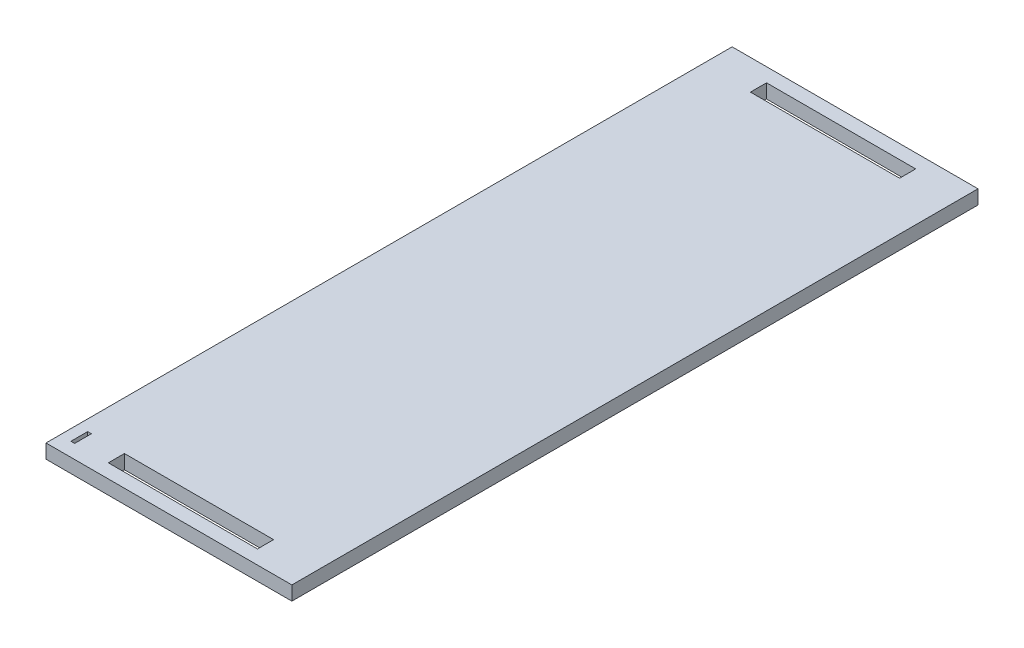
ISO-10303-21;
HEADER;
FILE_DESCRIPTION(('STEP AP214'),'2;1');
FILE_NAME('part.step','',(''),(''),'','','');
FILE_SCHEMA(('AUTOMOTIVE_DESIGN { 1 0 10303 214 1 1 1 1 }'));
ENDSEC;
DATA;
#1=APPLICATION_CONTEXT('core data for automotive mechanical design processes');
#2=APPLICATION_PROTOCOL_DEFINITION('international standard','automotive_design',2000,#1);
#3=PRODUCT_CONTEXT('',#1,'mechanical');
#4=PRODUCT('Part','Part','',(#3));
#5=PRODUCT_RELATED_PRODUCT_CATEGORY('part','',(#4));
#6=PRODUCT_DEFINITION_FORMATION('','',#4);
#7=PRODUCT_DEFINITION_CONTEXT('part definition',#1,'design');
#8=PRODUCT_DEFINITION('design','',#6,#7);
#9=PRODUCT_DEFINITION_SHAPE('','',#8);
#10=(LENGTH_UNIT() NAMED_UNIT(*) SI_UNIT(.MILLI.,.METRE.));
#11=(NAMED_UNIT(*) PLANE_ANGLE_UNIT() SI_UNIT($,.RADIAN.));
#12=(NAMED_UNIT(*) SI_UNIT($,.STERADIAN.) SOLID_ANGLE_UNIT());
#13=UNCERTAINTY_MEASURE_WITH_UNIT(LENGTH_MEASURE(1.E-05),#10,'distance_accuracy_value','');
#14=(GEOMETRIC_REPRESENTATION_CONTEXT(3) GLOBAL_UNCERTAINTY_ASSIGNED_CONTEXT((#13)) GLOBAL_UNIT_ASSIGNED_CONTEXT((#10,
#11,#12)) REPRESENTATION_CONTEXT('',''));
#15=CARTESIAN_POINT('',(0.,0.,0.));
#16=DIRECTION('',(0.,0.,1.));
#17=DIRECTION('',(1.,0.,0.));
#18=AXIS2_PLACEMENT_3D('',#15,#16,#17);
#19=CARTESIAN_POINT('',(0.,2.9972,0.));
#20=DIRECTION('',(0.,1.,0.));
#21=DIRECTION('',(0.,0.,1.));
#22=AXIS2_PLACEMENT_3D('',#19,#20,#21);
#23=PLANE('',#22);
#24=DIRECTION('',(0.,0.,1.));
#25=VECTOR('',#24,1.);
#26=CARTESIAN_POINT('',(-26.1690230999999,2.9972,73.025));
#27=LINE('',#26,#25);
#28=CARTESIAN_POINT('',(-26.1690230999999,2.9972,-73.025));
#29=VERTEX_POINT('',#28);
#30=CARTESIAN_POINT('',(-26.1690230999999,2.9972,73.025));
#31=VERTEX_POINT('',#30);
#32=EDGE_CURVE('E287',#29,#31,#27,.T.);
#33=ORIENTED_EDGE('',*,*,#32,.T.);
#34=DIRECTION('',(1.,0.,0.));
#35=VECTOR('',#34,1.);
#36=CARTESIAN_POINT('',(26.1690231000001,2.9972,73.025));
#37=LINE('',#36,#35);
#38=CARTESIAN_POINT('',(26.1690231000001,2.9972,73.025));
#39=VERTEX_POINT('',#38);
#40=EDGE_CURVE('E291',#31,#39,#37,.T.);
#41=ORIENTED_EDGE('',*,*,#40,.T.);
#42=DIRECTION('',(0.,0.,-1.));
#43=VECTOR('',#42,1.);
#44=CARTESIAN_POINT('',(26.1690231000001,2.9972,73.025));
#45=LINE('',#44,#43);
#46=CARTESIAN_POINT('',(26.1690231000001,2.9972,-73.025));
#47=VERTEX_POINT('',#46);
#48=EDGE_CURVE('E295',#39,#47,#45,.T.);
#49=ORIENTED_EDGE('',*,*,#48,.T.);
#50=DIRECTION('',(-1.,0.,0.));
#51=VECTOR('',#50,1.);
#52=CARTESIAN_POINT('',(26.1690231000001,2.9972,-73.025));
#53=LINE('',#52,#51);
#54=EDGE_CURVE('E298',#47,#29,#53,.T.);
#55=ORIENTED_EDGE('',*,*,#54,.T.);
#56=EDGE_LOOP('',(#33,#41,#49,#55));
#57=FACE_BOUND('',#56,.T.);
#58=DIRECTION('',(1.,0.,0.));
#59=VECTOR('',#58,1.);
#60=CARTESIAN_POINT('',(-15.875,2.9972,-66.6242));
#61=LINE('',#60,#59);
#62=CARTESIAN_POINT('',(-15.875,2.9972,-66.6242));
#63=VERTEX_POINT('',#62);
#64=CARTESIAN_POINT('',(15.875,2.9972,-66.6242));
#65=VERTEX_POINT('',#64);
#66=EDGE_CURVE('E247',#63,#65,#61,.T.);
#67=ORIENTED_EDGE('',*,*,#66,.F.);
#68=DIRECTION('',(0.,0.,1.));
#69=VECTOR('',#68,1.);
#70=CARTESIAN_POINT('',(-15.875,2.9972,-70.0532));
#71=LINE('',#70,#69);
#72=CARTESIAN_POINT('',(-15.875,2.9972,-70.0532));
#73=VERTEX_POINT('',#72);
#74=EDGE_CURVE('E244',#73,#63,#71,.T.);
#75=ORIENTED_EDGE('',*,*,#74,.F.);
#76=DIRECTION('',(-1.,0.,0.));
#77=VECTOR('',#76,1.);
#78=CARTESIAN_POINT('',(-15.875,2.9972,-70.0532));
#79=LINE('',#78,#77);
#80=CARTESIAN_POINT('',(15.875,2.9972,-70.0532));
#81=VERTEX_POINT('',#80);
#82=EDGE_CURVE('E255',#81,#73,#79,.T.);
#83=ORIENTED_EDGE('',*,*,#82,.F.);
#84=DIRECTION('',(0.,0.,-1.));
#85=VECTOR('',#84,1.);
#86=CARTESIAN_POINT('',(15.875,2.9972,-70.0532));
#87=LINE('',#86,#85);
#88=EDGE_CURVE('E251',#65,#81,#87,.T.);
#89=ORIENTED_EDGE('',*,*,#88,.F.);
#90=EDGE_LOOP('',(#67,#75,#83,#89));
#91=FACE_BOUND('',#90,.T.);
#92=DIRECTION('',(1.,0.,0.));
#93=VECTOR('',#92,1.);
#94=CARTESIAN_POINT('',(-15.875,2.9972,70.0532));
#95=LINE('',#94,#93);
#96=CARTESIAN_POINT('',(-15.875,2.9972,70.0532));
#97=VERTEX_POINT('',#96);
#98=CARTESIAN_POINT('',(15.875,2.9972,70.0532));
#99=VERTEX_POINT('',#98);
#100=EDGE_CURVE('E204',#97,#99,#95,.T.);
#101=ORIENTED_EDGE('',*,*,#100,.F.);
#102=DIRECTION('',(0.,0.,1.));
#103=VECTOR('',#102,1.);
#104=CARTESIAN_POINT('',(-15.875,2.9972,66.6242));
#105=LINE('',#104,#103);
#106=CARTESIAN_POINT('',(-15.875,2.9972,66.6242));
#107=VERTEX_POINT('',#106);
#108=EDGE_CURVE('E201',#107,#97,#105,.T.);
#109=ORIENTED_EDGE('',*,*,#108,.F.);
#110=DIRECTION('',(-1.,0.,0.));
#111=VECTOR('',#110,1.);
#112=CARTESIAN_POINT('',(-15.875,2.9972,66.6242));
#113=LINE('',#112,#111);
#114=CARTESIAN_POINT('',(15.875,2.9972,66.6242));
#115=VERTEX_POINT('',#114);
#116=EDGE_CURVE('E212',#115,#107,#113,.T.);
#117=ORIENTED_EDGE('',*,*,#116,.F.);
#118=DIRECTION('',(0.,0.,-1.));
#119=VECTOR('',#118,1.);
#120=CARTESIAN_POINT('',(15.875,2.9972,66.6242));
#121=LINE('',#120,#119);
#122=EDGE_CURVE('E208',#99,#115,#121,.T.);
#123=ORIENTED_EDGE('',*,*,#122,.F.);
#124=EDGE_LOOP('',(#101,#109,#117,#123));
#125=FACE_BOUND('',#124,.T.);
#126=DIRECTION('',(1.,0.,0.));
#127=VECTOR('',#126,1.);
#128=CARTESIAN_POINT('',(-23.8297399915825,2.9972,70.0532));
#129=LINE('',#128,#127);
#130=CARTESIAN_POINT('',(-23.8297399915825,2.9972,70.0532));
#131=VERTEX_POINT('',#130);
#132=CARTESIAN_POINT('',(-23.0359899915825,2.9972,70.0532));
#133=VERTEX_POINT('',#132);
#134=EDGE_CURVE('E162',#131,#133,#129,.T.);
#135=ORIENTED_EDGE('',*,*,#134,.F.);
#136=DIRECTION('',(0.,0.,1.));
#137=VECTOR('',#136,1.);
#138=CARTESIAN_POINT('',(-23.8297399915825,2.9972,66.4972));
#139=LINE('',#138,#137);
#140=CARTESIAN_POINT('',(-23.8297399915825,2.9972,66.4972));
#141=VERTEX_POINT('',#140);
#142=EDGE_CURVE('E153',#141,#131,#139,.T.);
#143=ORIENTED_EDGE('',*,*,#142,.F.);
#144=DIRECTION('',(-1.,0.,0.));
#145=VECTOR('',#144,1.);
#146=CARTESIAN_POINT('',(-23.8297399915825,2.9972,66.4972));
#147=LINE('',#146,#145);
#148=CARTESIAN_POINT('',(-23.0359899915825,2.9972,66.4972));
#149=VERTEX_POINT('',#148);
#150=EDGE_CURVE('E179',#149,#141,#147,.T.);
#151=ORIENTED_EDGE('',*,*,#150,.F.);
#152=DIRECTION('',(0.,0.,-1.));
#153=VECTOR('',#152,1.);
#154=CARTESIAN_POINT('',(-23.0359899915825,2.9972,66.4972));
#155=LINE('',#154,#153);
#156=EDGE_CURVE('E175',#133,#149,#155,.T.);
#157=ORIENTED_EDGE('',*,*,#156,.F.);
#158=EDGE_LOOP('',(#135,#143,#151,#157));
#159=FACE_BOUND('',#158,.T.);
#160=ADVANCED_FACE('F39',(#57,#91,#125,#159),#23,.T.);
#161=CARTESIAN_POINT('',(0.,0.,0.));
#162=DIRECTION('',(0.,1.,0.));
#163=DIRECTION('',(0.,0.,1.));
#164=AXIS2_PLACEMENT_3D('',#161,#162,#163);
#165=PLANE('',#164);
#166=DIRECTION('',(0.,0.,1.));
#167=VECTOR('',#166,1.);
#168=CARTESIAN_POINT('',(-15.875,0.,66.6242));
#169=LINE('',#168,#167);
#170=CARTESIAN_POINT('',(-15.875,0.,66.6242));
#171=VERTEX_POINT('',#170);
#172=CARTESIAN_POINT('',(-15.875,0.,70.0532));
#173=VERTEX_POINT('',#172);
#174=EDGE_CURVE('E171',#171,#173,#169,.T.);
#175=ORIENTED_EDGE('',*,*,#174,.T.);
#176=DIRECTION('',(1.,0.,0.));
#177=VECTOR('',#176,1.);
#178=CARTESIAN_POINT('',(-15.875,0.,70.0532));
#179=LINE('',#178,#177);
#180=CARTESIAN_POINT('',(15.875,0.,70.0532));
#181=VERTEX_POINT('',#180);
#182=EDGE_CURVE('E219',#173,#181,#179,.T.);
#183=ORIENTED_EDGE('',*,*,#182,.T.);
#184=DIRECTION('',(0.,0.,-1.));
#185=VECTOR('',#184,1.);
#186=CARTESIAN_POINT('',(15.875,0.,66.6242));
#187=LINE('',#186,#185);
#188=CARTESIAN_POINT('',(15.875,0.,66.6242));
#189=VERTEX_POINT('',#188);
#190=EDGE_CURVE('E223',#181,#189,#187,.T.);
#191=ORIENTED_EDGE('',*,*,#190,.T.);
#192=DIRECTION('',(-1.,0.,0.));
#193=VECTOR('',#192,1.);
#194=CARTESIAN_POINT('',(-15.875,0.,66.6242));
#195=LINE('',#194,#193);
#196=EDGE_CURVE('E205',#189,#171,#195,.T.);
#197=ORIENTED_EDGE('',*,*,#196,.T.);
#198=EDGE_LOOP('',(#175,#183,#191,#197));
#199=FACE_BOUND('',#198,.T.);
#200=DIRECTION('',(0.,0.,1.));
#201=VECTOR('',#200,1.);
#202=CARTESIAN_POINT('',(-26.1690230999999,0.,73.025));
#203=LINE('',#202,#201);
#204=CARTESIAN_POINT('',(-26.1690230999999,0.,-73.025));
#205=VERTEX_POINT('',#204);
#206=CARTESIAN_POINT('',(-26.1690230999999,0.,73.025));
#207=VERTEX_POINT('',#206);
#208=EDGE_CURVE('E286',#205,#207,#203,.T.);
#209=ORIENTED_EDGE('',*,*,#208,.F.);
#210=DIRECTION('',(-1.,0.,0.));
#211=VECTOR('',#210,1.);
#212=CARTESIAN_POINT('',(26.1690231000001,0.,-73.025));
#213=LINE('',#212,#211);
#214=CARTESIAN_POINT('',(26.1690231000001,0.,-73.025));
#215=VERTEX_POINT('',#214);
#216=EDGE_CURVE('E292',#215,#205,#213,.T.);
#217=ORIENTED_EDGE('',*,*,#216,.F.);
#218=DIRECTION('',(0.,0.,-1.));
#219=VECTOR('',#218,1.);
#220=CARTESIAN_POINT('',(26.1690231000001,0.,73.025));
#221=LINE('',#220,#219);
#222=CARTESIAN_POINT('',(26.1690231000001,0.,73.025));
#223=VERTEX_POINT('',#222);
#224=EDGE_CURVE('E308',#223,#215,#221,.T.);
#225=ORIENTED_EDGE('',*,*,#224,.F.);
#226=DIRECTION('',(1.,0.,0.));
#227=VECTOR('',#226,1.);
#228=CARTESIAN_POINT('',(26.1690231000001,0.,73.025));
#229=LINE('',#228,#227);
#230=EDGE_CURVE('E305',#207,#223,#229,.T.);
#231=ORIENTED_EDGE('',*,*,#230,.F.);
#232=EDGE_LOOP('',(#209,#217,#225,#231));
#233=FACE_BOUND('',#232,.T.);
#234=DIRECTION('',(0.,0.,1.));
#235=VECTOR('',#234,1.);
#236=CARTESIAN_POINT('',(-15.875,0.,-70.0532));
#237=LINE('',#236,#235);
#238=CARTESIAN_POINT('',(-15.875,0.,-70.0532));
#239=VERTEX_POINT('',#238);
#240=CARTESIAN_POINT('',(-15.875,0.,-66.6242));
#241=VERTEX_POINT('',#240);
#242=EDGE_CURVE('E243',#239,#241,#237,.T.);
#243=ORIENTED_EDGE('',*,*,#242,.T.);
#244=DIRECTION('',(1.,0.,0.));
#245=VECTOR('',#244,1.);
#246=CARTESIAN_POINT('',(-15.875,0.,-66.6242));
#247=LINE('',#246,#245);
#248=CARTESIAN_POINT('',(15.875,0.,-66.6242));
#249=VERTEX_POINT('',#248);
#250=EDGE_CURVE('E262',#241,#249,#247,.T.);
#251=ORIENTED_EDGE('',*,*,#250,.T.);
#252=DIRECTION('',(0.,0.,-1.));
#253=VECTOR('',#252,1.);
#254=CARTESIAN_POINT('',(15.875,0.,-70.0532));
#255=LINE('',#254,#253);
#256=CARTESIAN_POINT('',(15.875,0.,-70.0532));
#257=VERTEX_POINT('',#256);
#258=EDGE_CURVE('E266',#249,#257,#255,.T.);
#259=ORIENTED_EDGE('',*,*,#258,.T.);
#260=DIRECTION('',(-1.,0.,0.));
#261=VECTOR('',#260,1.);
#262=CARTESIAN_POINT('',(-15.875,0.,-70.0532));
#263=LINE('',#262,#261);
#264=EDGE_CURVE('E248',#257,#239,#263,.T.);
#265=ORIENTED_EDGE('',*,*,#264,.T.);
#266=EDGE_LOOP('',(#243,#251,#259,#265));
#267=FACE_BOUND('',#266,.T.);
#268=DIRECTION('',(0.,0.,1.));
#269=VECTOR('',#268,1.);
#270=CARTESIAN_POINT('',(-23.8297399915825,0.,66.4972));
#271=LINE('',#270,#269);
#272=CARTESIAN_POINT('',(-23.8297399915825,0.,66.4972));
#273=VERTEX_POINT('',#272);
#274=CARTESIAN_POINT('',(-23.8297399915825,0.,70.0532));
#275=VERTEX_POINT('',#274);
#276=EDGE_CURVE('E63',#273,#275,#271,.T.);
#277=ORIENTED_EDGE('',*,*,#276,.T.);
#278=DIRECTION('',(1.,0.,0.));
#279=VECTOR('',#278,1.);
#280=CARTESIAN_POINT('',(-23.8297399915825,0.,70.0532));
#281=LINE('',#280,#279);
#282=CARTESIAN_POINT('',(-23.0359899915825,0.,70.0532));
#283=VERTEX_POINT('',#282);
#284=EDGE_CURVE('E169',#275,#283,#281,.T.);
#285=ORIENTED_EDGE('',*,*,#284,.T.);
#286=DIRECTION('',(0.,0.,-1.));
#287=VECTOR('',#286,1.);
#288=CARTESIAN_POINT('',(-23.0359899915825,0.,66.4972));
#289=LINE('',#288,#287);
#290=CARTESIAN_POINT('',(-23.0359899915825,0.,66.4972));
#291=VERTEX_POINT('',#290);
#292=EDGE_CURVE('E188',#283,#291,#289,.T.);
#293=ORIENTED_EDGE('',*,*,#292,.T.);
#294=DIRECTION('',(-1.,0.,0.));
#295=VECTOR('',#294,1.);
#296=CARTESIAN_POINT('',(-23.8297399915825,0.,66.4972));
#297=LINE('',#296,#295);
#298=EDGE_CURVE('E163',#291,#273,#297,.T.);
#299=ORIENTED_EDGE('',*,*,#298,.T.);
#300=EDGE_LOOP('',(#277,#285,#293,#299));
#301=FACE_BOUND('',#300,.T.);
#302=ADVANCED_FACE('F331',(#199,#233,#267,#301),#165,.F.);
#303=CARTESIAN_POINT('',(-26.1690230999999,2.9972,73.025));
#304=DIRECTION('',(1.,0.,0.));
#305=DIRECTION('',(0.,0.,-1.));
#306=AXIS2_PLACEMENT_3D('',#303,#304,#305);
#307=PLANE('',#306);
#308=ORIENTED_EDGE('',*,*,#208,.T.);
#309=DIRECTION('',(0.,-1.,0.));
#310=VECTOR('',#309,1.);
#311=CARTESIAN_POINT('',(-26.1690230999999,2.9972,73.025));
#312=LINE('',#311,#310);
#313=EDGE_CURVE('E11',#31,#207,#312,.T.);
#314=ORIENTED_EDGE('',*,*,#313,.F.);
#315=ORIENTED_EDGE('',*,*,#32,.F.);
#316=DIRECTION('',(0.,-1.,0.));
#317=VECTOR('',#316,1.);
#318=CARTESIAN_POINT('',(-26.1690230999999,2.9972,-73.025));
#319=LINE('',#318,#317);
#320=EDGE_CURVE('E301',#29,#205,#319,.T.);
#321=ORIENTED_EDGE('',*,*,#320,.T.);
#322=EDGE_LOOP('',(#308,#314,#315,#321));
#323=FACE_BOUND('',#322,.T.);
#324=ADVANCED_FACE('F41',(#323),#307,.F.);
#325=CARTESIAN_POINT('',(26.1690231000001,2.9972,73.025));
#326=DIRECTION('',(0.,0.,-1.));
#327=DIRECTION('',(-1.,0.,0.));
#328=AXIS2_PLACEMENT_3D('',#325,#326,#327);
#329=PLANE('',#328);
#330=ORIENTED_EDGE('',*,*,#230,.T.);
#331=DIRECTION('',(0.,-1.,0.));
#332=VECTOR('',#331,1.);
#333=CARTESIAN_POINT('',(26.1690231000001,2.9972,73.025));
#334=LINE('',#333,#332);
#335=EDGE_CURVE('E48',#39,#223,#334,.T.);
#336=ORIENTED_EDGE('',*,*,#335,.F.);
#337=ORIENTED_EDGE('',*,*,#40,.F.);
#338=ORIENTED_EDGE('',*,*,#313,.T.);
#339=EDGE_LOOP('',(#330,#336,#337,#338));
#340=FACE_BOUND('',#339,.T.);
#341=ADVANCED_FACE('F342',(#340),#329,.F.);
#342=CARTESIAN_POINT('',(26.1690231000001,2.9972,73.025));
#343=DIRECTION('',(-1.,0.,0.));
#344=DIRECTION('',(0.,0.,1.));
#345=AXIS2_PLACEMENT_3D('',#342,#343,#344);
#346=PLANE('',#345);
#347=ORIENTED_EDGE('',*,*,#224,.T.);
#348=DIRECTION('',(0.,-1.,0.));
#349=VECTOR('',#348,1.);
#350=CARTESIAN_POINT('',(26.1690231000001,2.9972,-73.025));
#351=LINE('',#350,#349);
#352=EDGE_CURVE('E316',#47,#215,#351,.T.);
#353=ORIENTED_EDGE('',*,*,#352,.F.);
#354=ORIENTED_EDGE('',*,*,#48,.F.);
#355=ORIENTED_EDGE('',*,*,#335,.T.);
#356=EDGE_LOOP('',(#347,#353,#354,#355));
#357=FACE_BOUND('',#356,.T.);
#358=ADVANCED_FACE('F325',(#357),#346,.F.);
#359=CARTESIAN_POINT('',(26.1690231000001,2.9972,-73.025));
#360=DIRECTION('',(0.,0.,1.));
#361=DIRECTION('',(1.,0.,0.));
#362=AXIS2_PLACEMENT_3D('',#359,#360,#361);
#363=PLANE('',#362);
#364=ORIENTED_EDGE('',*,*,#216,.T.);
#365=ORIENTED_EDGE('',*,*,#320,.F.);
#366=ORIENTED_EDGE('',*,*,#54,.F.);
#367=ORIENTED_EDGE('',*,*,#352,.T.);
#368=EDGE_LOOP('',(#364,#365,#366,#367));
#369=FACE_BOUND('',#368,.T.);
#370=ADVANCED_FACE('F335',(#369),#363,.F.);
#371=CARTESIAN_POINT('',(-15.875,2.9972,-70.0532));
#372=DIRECTION('',(1.,0.,0.));
#373=DIRECTION('',(0.,0.,-1.));
#374=AXIS2_PLACEMENT_3D('',#371,#372,#373);
#375=PLANE('',#374);
#376=ORIENTED_EDGE('',*,*,#242,.F.);
#377=DIRECTION('',(0.,-1.,0.));
#378=VECTOR('',#377,1.);
#379=CARTESIAN_POINT('',(-15.875,2.9972,-70.0532));
#380=LINE('',#379,#378);
#381=EDGE_CURVE('E258',#73,#239,#380,.T.);
#382=ORIENTED_EDGE('',*,*,#381,.F.);
#383=ORIENTED_EDGE('',*,*,#74,.T.);
#384=DIRECTION('',(0.,-1.,0.));
#385=VECTOR('',#384,1.);
#386=CARTESIAN_POINT('',(-15.875,2.9972,-66.6242));
#387=LINE('',#386,#385);
#388=EDGE_CURVE('E282',#63,#241,#387,.T.);
#389=ORIENTED_EDGE('',*,*,#388,.T.);
#390=EDGE_LOOP('',(#376,#382,#383,#389));
#391=FACE_BOUND('',#390,.T.);
#392=ADVANCED_FACE('F357',(#391),#375,.T.);
#393=CARTESIAN_POINT('',(-15.875,2.9972,-66.6242));
#394=DIRECTION('',(0.,0.,-1.));
#395=DIRECTION('',(-1.,0.,0.));
#396=AXIS2_PLACEMENT_3D('',#393,#394,#395);
#397=PLANE('',#396);
#398=ORIENTED_EDGE('',*,*,#250,.F.);
#399=ORIENTED_EDGE('',*,*,#388,.F.);
#400=ORIENTED_EDGE('',*,*,#66,.T.);
#401=DIRECTION('',(0.,-1.,0.));
#402=VECTOR('',#401,1.);
#403=CARTESIAN_POINT('',(15.875,2.9972,-66.6242));
#404=LINE('',#403,#402);
#405=EDGE_CURVE('E279',#65,#249,#404,.T.);
#406=ORIENTED_EDGE('',*,*,#405,.T.);
#407=EDGE_LOOP('',(#398,#399,#400,#406));
#408=FACE_BOUND('',#407,.T.);
#409=ADVANCED_FACE('F364',(#408),#397,.T.);
#410=CARTESIAN_POINT('',(15.875,2.9972,-70.0532));
#411=DIRECTION('',(-1.,0.,0.));
#412=DIRECTION('',(0.,0.,1.));
#413=AXIS2_PLACEMENT_3D('',#410,#411,#412);
#414=PLANE('',#413);
#415=ORIENTED_EDGE('',*,*,#258,.F.);
#416=ORIENTED_EDGE('',*,*,#405,.F.);
#417=ORIENTED_EDGE('',*,*,#88,.T.);
#418=DIRECTION('',(0.,-1.,0.));
#419=VECTOR('',#418,1.);
#420=CARTESIAN_POINT('',(15.875,2.9972,-70.0532));
#421=LINE('',#420,#419);
#422=EDGE_CURVE('E276',#81,#257,#421,.T.);
#423=ORIENTED_EDGE('',*,*,#422,.T.);
#424=EDGE_LOOP('',(#415,#416,#417,#423));
#425=FACE_BOUND('',#424,.T.);
#426=ADVANCED_FACE('F369',(#425),#414,.T.);
#427=CARTESIAN_POINT('',(-15.875,2.9972,-70.0532));
#428=DIRECTION('',(0.,0.,1.));
#429=DIRECTION('',(1.,0.,0.));
#430=AXIS2_PLACEMENT_3D('',#427,#428,#429);
#431=PLANE('',#430);
#432=ORIENTED_EDGE('',*,*,#264,.F.);
#433=ORIENTED_EDGE('',*,*,#422,.F.);
#434=ORIENTED_EDGE('',*,*,#82,.T.);
#435=ORIENTED_EDGE('',*,*,#381,.T.);
#436=EDGE_LOOP('',(#432,#433,#434,#435));
#437=FACE_BOUND('',#436,.T.);
#438=ADVANCED_FACE('F376',(#437),#431,.T.);
#439=CARTESIAN_POINT('',(-15.875,2.9972,66.6242));
#440=DIRECTION('',(1.,0.,0.));
#441=DIRECTION('',(0.,0.,-1.));
#442=AXIS2_PLACEMENT_3D('',#439,#440,#441);
#443=PLANE('',#442);
#444=ORIENTED_EDGE('',*,*,#174,.F.);
#445=DIRECTION('',(0.,-1.,0.));
#446=VECTOR('',#445,1.);
#447=CARTESIAN_POINT('',(-15.875,2.9972,66.6242));
#448=LINE('',#447,#446);
#449=EDGE_CURVE('E215',#107,#171,#448,.T.);
#450=ORIENTED_EDGE('',*,*,#449,.F.);
#451=ORIENTED_EDGE('',*,*,#108,.T.);
#452=DIRECTION('',(0.,-1.,0.));
#453=VECTOR('',#452,1.);
#454=CARTESIAN_POINT('',(-15.875,2.9972,70.0532));
#455=LINE('',#454,#453);
#456=EDGE_CURVE('E239',#97,#173,#455,.T.);
#457=ORIENTED_EDGE('',*,*,#456,.T.);
#458=EDGE_LOOP('',(#444,#450,#451,#457));
#459=FACE_BOUND('',#458,.T.);
#460=ADVANCED_FACE('F398',(#459),#443,.T.);
#461=CARTESIAN_POINT('',(-15.875,2.9972,70.0532));
#462=DIRECTION('',(0.,0.,-1.));
#463=DIRECTION('',(-1.,0.,0.));
#464=AXIS2_PLACEMENT_3D('',#461,#462,#463);
#465=PLANE('',#464);
#466=ORIENTED_EDGE('',*,*,#182,.F.);
#467=ORIENTED_EDGE('',*,*,#456,.F.);
#468=ORIENTED_EDGE('',*,*,#100,.T.);
#469=DIRECTION('',(0.,-1.,0.));
#470=VECTOR('',#469,1.);
#471=CARTESIAN_POINT('',(15.875,2.9972,70.0532));
#472=LINE('',#471,#470);
#473=EDGE_CURVE('E236',#99,#181,#472,.T.);
#474=ORIENTED_EDGE('',*,*,#473,.T.);
#475=EDGE_LOOP('',(#466,#467,#468,#474));
#476=FACE_BOUND('',#475,.T.);
#477=ADVANCED_FACE('F392',(#476),#465,.T.);
#478=CARTESIAN_POINT('',(15.875,2.9972,66.6242));
#479=DIRECTION('',(-1.,0.,0.));
#480=DIRECTION('',(0.,0.,1.));
#481=AXIS2_PLACEMENT_3D('',#478,#479,#480);
#482=PLANE('',#481);
#483=ORIENTED_EDGE('',*,*,#190,.F.);
#484=ORIENTED_EDGE('',*,*,#473,.F.);
#485=ORIENTED_EDGE('',*,*,#122,.T.);
#486=DIRECTION('',(0.,-1.,0.));
#487=VECTOR('',#486,1.);
#488=CARTESIAN_POINT('',(15.875,2.9972,66.6242));
#489=LINE('',#488,#487);
#490=EDGE_CURVE('E233',#115,#189,#489,.T.);
#491=ORIENTED_EDGE('',*,*,#490,.T.);
#492=EDGE_LOOP('',(#483,#484,#485,#491));
#493=FACE_BOUND('',#492,.T.);
#494=ADVANCED_FACE('F395',(#493),#482,.T.);
#495=CARTESIAN_POINT('',(-15.875,2.9972,66.6242));
#496=DIRECTION('',(0.,0.,1.));
#497=DIRECTION('',(1.,0.,0.));
#498=AXIS2_PLACEMENT_3D('',#495,#496,#497);
#499=PLANE('',#498);
#500=ORIENTED_EDGE('',*,*,#196,.F.);
#501=ORIENTED_EDGE('',*,*,#490,.F.);
#502=ORIENTED_EDGE('',*,*,#116,.T.);
#503=ORIENTED_EDGE('',*,*,#449,.T.);
#504=EDGE_LOOP('',(#500,#501,#502,#503));
#505=FACE_BOUND('',#504,.T.);
#506=ADVANCED_FACE('F401',(#505),#499,.T.);
#507=CARTESIAN_POINT('',(-23.8297399915825,2.9972,66.4972));
#508=DIRECTION('',(1.,0.,0.));
#509=DIRECTION('',(0.,0.,-1.));
#510=AXIS2_PLACEMENT_3D('',#507,#508,#509);
#511=PLANE('',#510);
#512=ORIENTED_EDGE('',*,*,#276,.F.);
#513=DIRECTION('',(0.,-1.,0.));
#514=VECTOR('',#513,1.);
#515=CARTESIAN_POINT('',(-23.8297399915825,2.9972,66.4972));
#516=LINE('',#515,#514);
#517=EDGE_CURVE('E157',#141,#273,#516,.T.);
#518=ORIENTED_EDGE('',*,*,#517,.F.);
#519=ORIENTED_EDGE('',*,*,#142,.T.);
#520=DIRECTION('',(0.,-1.,0.));
#521=VECTOR('',#520,1.);
#522=CARTESIAN_POINT('',(-23.8297399915825,2.9972,70.0532));
#523=LINE('',#522,#521);
#524=EDGE_CURVE('E156',#131,#275,#523,.T.);
#525=ORIENTED_EDGE('',*,*,#524,.T.);
#526=EDGE_LOOP('',(#512,#518,#519,#525));
#527=FACE_BOUND('',#526,.T.);
#528=ADVANCED_FACE('F155',(#527),#511,.T.);
#529=CARTESIAN_POINT('',(-23.8297399915825,2.9972,70.0532));
#530=DIRECTION('',(0.,0.,-1.));
#531=DIRECTION('',(-1.,0.,0.));
#532=AXIS2_PLACEMENT_3D('',#529,#530,#531);
#533=PLANE('',#532);
#534=ORIENTED_EDGE('',*,*,#284,.F.);
#535=ORIENTED_EDGE('',*,*,#524,.F.);
#536=ORIENTED_EDGE('',*,*,#134,.T.);
#537=DIRECTION('',(0.,-1.,0.));
#538=VECTOR('',#537,1.);
#539=CARTESIAN_POINT('',(-23.0359899915825,2.9972,70.0532));
#540=LINE('',#539,#538);
#541=EDGE_CURVE('E172',#133,#283,#540,.T.);
#542=ORIENTED_EDGE('',*,*,#541,.T.);
#543=EDGE_LOOP('',(#534,#535,#536,#542));
#544=FACE_BOUND('',#543,.T.);
#545=ADVANCED_FACE('F166',(#544),#533,.T.);
#546=CARTESIAN_POINT('',(-23.0359899915825,2.9972,66.4972));
#547=DIRECTION('',(-1.,0.,0.));
#548=DIRECTION('',(0.,0.,1.));
#549=AXIS2_PLACEMENT_3D('',#546,#547,#548);
#550=PLANE('',#549);
#551=ORIENTED_EDGE('',*,*,#292,.F.);
#552=ORIENTED_EDGE('',*,*,#541,.F.);
#553=ORIENTED_EDGE('',*,*,#156,.T.);
#554=DIRECTION('',(0.,-1.,0.));
#555=VECTOR('',#554,1.);
#556=CARTESIAN_POINT('',(-23.0359899915825,2.9972,66.4972));
#557=LINE('',#556,#555);
#558=EDGE_CURVE('E55',#149,#291,#557,.T.);
#559=ORIENTED_EDGE('',*,*,#558,.T.);
#560=EDGE_LOOP('',(#551,#552,#553,#559));
#561=FACE_BOUND('',#560,.T.);
#562=ADVANCED_FACE('F458',(#561),#550,.T.);
#563=CARTESIAN_POINT('',(-23.8297399915825,2.9972,66.4972));
#564=DIRECTION('',(0.,0.,1.));
#565=DIRECTION('',(1.,0.,0.));
#566=AXIS2_PLACEMENT_3D('',#563,#564,#565);
#567=PLANE('',#566);
#568=ORIENTED_EDGE('',*,*,#298,.F.);
#569=ORIENTED_EDGE('',*,*,#558,.F.);
#570=ORIENTED_EDGE('',*,*,#150,.T.);
#571=ORIENTED_EDGE('',*,*,#517,.T.);
#572=EDGE_LOOP('',(#568,#569,#570,#571));
#573=FACE_BOUND('',#572,.T.);
#574=ADVANCED_FACE('F466',(#573),#567,.T.);
#575=CLOSED_SHELL('',(#160,#302,#324,#341,#358,#370,#392,#409,#426,#438,#460,#477,#494,#506,
#528,#545,#562,#574));
#576=MANIFOLD_SOLID_BREP('B2',#575);
#577=ADVANCED_BREP_SHAPE_REPRESENTATION('',(#18,#576),#14);
#578=SHAPE_DEFINITION_REPRESENTATION(#9,#577);
ENDSEC;
END-ISO-10303-21;
